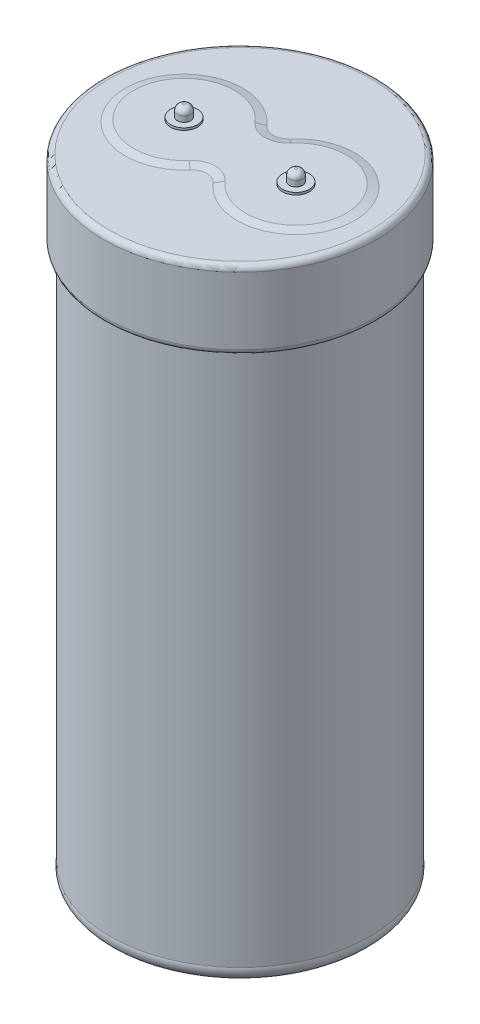
ISO-10303-21;
HEADER;
FILE_DESCRIPTION(('STEP AP214'),'2;1');
FILE_NAME('part.step','',(''),(''),'','','');
FILE_SCHEMA(('AUTOMOTIVE_DESIGN { 1 0 10303 214 1 1 1 1 }'));
ENDSEC;
DATA;
#1=APPLICATION_CONTEXT('core data for automotive mechanical design processes');
#2=APPLICATION_PROTOCOL_DEFINITION('international standard','automotive_design',2000,#1);
#3=PRODUCT_CONTEXT('',#1,'mechanical');
#4=PRODUCT('Part','Part','',(#3));
#5=PRODUCT_RELATED_PRODUCT_CATEGORY('part','',(#4));
#6=PRODUCT_DEFINITION_FORMATION('','',#4);
#7=PRODUCT_DEFINITION_CONTEXT('part definition',#1,'design');
#8=PRODUCT_DEFINITION('design','',#6,#7);
#9=PRODUCT_DEFINITION_SHAPE('','',#8);
#10=(LENGTH_UNIT() NAMED_UNIT(*) SI_UNIT(.MILLI.,.METRE.));
#11=(NAMED_UNIT(*) PLANE_ANGLE_UNIT() SI_UNIT($,.RADIAN.));
#12=(NAMED_UNIT(*) SI_UNIT($,.STERADIAN.) SOLID_ANGLE_UNIT());
#13=UNCERTAINTY_MEASURE_WITH_UNIT(LENGTH_MEASURE(1.E-05),#10,'distance_accuracy_value','');
#14=(GEOMETRIC_REPRESENTATION_CONTEXT(3) GLOBAL_UNCERTAINTY_ASSIGNED_CONTEXT((#13)) GLOBAL_UNIT_ASSIGNED_CONTEXT((#10,
#11,#12)) REPRESENTATION_CONTEXT('',''));
#15=CARTESIAN_POINT('',(0.,0.,0.));
#16=DIRECTION('',(0.,0.,1.));
#17=DIRECTION('',(1.,0.,0.));
#18=AXIS2_PLACEMENT_3D('',#15,#16,#17);
#19=CARTESIAN_POINT('',(0.,125.424101690233,0.));
#20=DIRECTION('',(0.,-1.,0.));
#21=DIRECTION('',(0.,0.,-1.));
#22=AXIS2_PLACEMENT_3D('',#19,#20,#21);
#23=PLANE('',#22);
#24=CARTESIAN_POINT('',(0.,125.424101690233,0.));
#25=DIRECTION('',(0.,-1.,0.));
#26=DIRECTION('',(0.,0.,-1.));
#27=AXIS2_PLACEMENT_3D('',#24,#25,#26);
#28=CIRCLE('',#27,58.5);
#29=CARTESIAN_POINT('',(0.,125.424101690233,-58.5));
#30=VERTEX_POINT('',#29);
#31=EDGE_CURVE('E175',#30,#30,#28,.F.);
#32=ORIENTED_EDGE('',*,*,#31,.T.);
#33=EDGE_LOOP('',(#32));
#34=FACE_BOUND('',#33,.T.);
#35=CARTESIAN_POINT('',(25.,125.424101690233,0.));
#36=DIRECTION('',(0.,1.,0.));
#37=DIRECTION('',(-1.,0.,0.));
#38=AXIS2_PLACEMENT_3D('',#35,#36,#37);
#39=CIRCLE('',#38,26.25);
#40=CARTESIAN_POINT('',(5.11363636363637,125.424101690233,17.134615295428));
#41=VERTEX_POINT('',#40);
#42=CARTESIAN_POINT('',(5.11363636363637,125.424101690233,-17.134615295428));
#43=VERTEX_POINT('',#42);
#44=EDGE_CURVE('E111',#41,#43,#39,.T.);
#45=ORIENTED_EDGE('',*,*,#44,.F.);
#46=CARTESIAN_POINT('',(0.,125.424101690233,21.540659228538));
#47=DIRECTION('',(0.,-1.,0.));
#48=DIRECTION('',(-1.,0.,0.));
#49=AXIS2_PLACEMENT_3D('',#46,#47,#48);
#50=CIRCLE('',#49,6.75);
#51=CARTESIAN_POINT('',(-5.11363636363636,125.424101690233,17.134615295428));
#52=VERTEX_POINT('',#51);
#53=EDGE_CURVE('E96',#52,#41,#50,.T.);
#54=ORIENTED_EDGE('',*,*,#53,.F.);
#55=CARTESIAN_POINT('',(-25.,125.424101690233,0.));
#56=DIRECTION('',(0.,1.,0.));
#57=DIRECTION('',(1.,0.,0.));
#58=AXIS2_PLACEMENT_3D('',#55,#56,#57);
#59=CIRCLE('',#58,26.25);
#60=CARTESIAN_POINT('',(-5.11363636363636,125.424101690233,-17.134615295428));
#61=VERTEX_POINT('',#60);
#62=EDGE_CURVE('E90',#61,#52,#59,.T.);
#63=ORIENTED_EDGE('',*,*,#62,.F.);
#64=CARTESIAN_POINT('',(0.,125.424101690233,-21.540659228538));
#65=DIRECTION('',(0.,-1.,0.));
#66=DIRECTION('',(1.,0.,0.));
#67=AXIS2_PLACEMENT_3D('',#64,#65,#66);
#68=CIRCLE('',#67,6.75);
#69=EDGE_CURVE('E94',#43,#61,#68,.T.);
#70=ORIENTED_EDGE('',*,*,#69,.F.);
#71=EDGE_LOOP('',(#45,#54,#63,#70));
#72=FACE_BOUND('',#71,.T.);
#73=ADVANCED_FACE('F44',(#34,#72),#23,.F.);
#74=CARTESIAN_POINT('',(0.,125.424101690233,0.));
#75=DIRECTION('',(0.,1.,0.));
#76=DIRECTION('',(0.,0.,1.));
#77=AXIS2_PLACEMENT_3D('',#74,#75,#76);
#78=CYLINDRICAL_SURFACE('',#77,61.);
#79=CARTESIAN_POINT('',(0.,92.9241016902328,0.));
#80=DIRECTION('',(0.,1.,0.));
#81=DIRECTION('',(0.,0.,1.));
#82=AXIS2_PLACEMENT_3D('',#79,#80,#81);
#83=CIRCLE('',#82,61.);
#84=CARTESIAN_POINT('',(0.,92.9241016902328,61.));
#85=VERTEX_POINT('',#84);
#86=EDGE_CURVE('E167',#85,#85,#83,.T.);
#87=ORIENTED_EDGE('',*,*,#86,.T.);
#88=EDGE_LOOP('',(#87));
#89=FACE_BOUND('',#88,.T.);
#90=CARTESIAN_POINT('',(0.,122.924101690233,0.));
#91=DIRECTION('',(0.,-1.,0.));
#92=DIRECTION('',(0.,0.,-1.));
#93=AXIS2_PLACEMENT_3D('',#90,#91,#92);
#94=CIRCLE('',#93,61.);
#95=CARTESIAN_POINT('',(0.,122.924101690233,-61.));
#96=VERTEX_POINT('',#95);
#97=EDGE_CURVE('E163',#96,#96,#94,.T.);
#98=ORIENTED_EDGE('',*,*,#97,.T.);
#99=EDGE_LOOP('',(#98));
#100=FACE_BOUND('',#99,.T.);
#101=ADVANCED_FACE('F239',(#89,#100),#78,.T.);
#102=CARTESIAN_POINT('',(61.,90.4241016902328,0.));
#103=DIRECTION('',(0.,1.,0.));
#104=DIRECTION('',(0.,0.,1.));
#105=AXIS2_PLACEMENT_3D('',#102,#103,#104);
#106=PLANE('',#105);
#107=CARTESIAN_POINT('',(0.,90.4241016902328,0.));
#108=DIRECTION('',(0.,1.,0.));
#109=DIRECTION('',(0.,0.,1.));
#110=AXIS2_PLACEMENT_3D('',#107,#108,#109);
#111=CIRCLE('',#110,58.5);
#112=CARTESIAN_POINT('',(0.,90.4241016902328,58.5));
#113=VERTEX_POINT('',#112);
#114=EDGE_CURVE('E171',#113,#113,#111,.F.);
#115=ORIENTED_EDGE('',*,*,#114,.T.);
#116=EDGE_LOOP('',(#115));
#117=FACE_BOUND('',#116,.T.);
#118=CARTESIAN_POINT('',(0.,90.4241016902328,0.));
#119=DIRECTION('',(0.,1.,0.));
#120=DIRECTION('',(0.,0.,1.));
#121=AXIS2_PLACEMENT_3D('',#118,#119,#120);
#122=CIRCLE('',#121,58.);
#123=CARTESIAN_POINT('',(0.,90.4241016902328,58.));
#124=VERTEX_POINT('',#123);
#125=EDGE_CURVE('E141',#124,#124,#122,.T.);
#126=ORIENTED_EDGE('',*,*,#125,.T.);
#127=EDGE_LOOP('',(#126));
#128=FACE_BOUND('',#127,.T.);
#129=ADVANCED_FACE('F245',(#117,#128),#106,.F.);
#130=CARTESIAN_POINT('',(0.,125.424101690233,0.));
#131=DIRECTION('',(0.,1.,0.));
#132=DIRECTION('',(0.,0.,1.));
#133=AXIS2_PLACEMENT_3D('',#130,#131,#132);
#134=CYLINDRICAL_SURFACE('',#133,58.);
#135=ORIENTED_EDGE('',*,*,#125,.F.);
#136=EDGE_LOOP('',(#135));
#137=FACE_BOUND('',#136,.T.);
#138=CARTESIAN_POINT('',(0.,-148.244074885505,0.));
#139=DIRECTION('',(0.,1.,0.));
#140=DIRECTION('',(0.,0.,1.));
#141=AXIS2_PLACEMENT_3D('',#138,#139,#140);
#142=CIRCLE('',#141,58.);
#143=CARTESIAN_POINT('',(0.,-148.244074885505,58.));
#144=VERTEX_POINT('',#143);
#145=EDGE_CURVE('E137',#144,#144,#142,.T.);
#146=ORIENTED_EDGE('',*,*,#145,.T.);
#147=EDGE_LOOP('',(#146));
#148=FACE_BOUND('',#147,.T.);
#149=ADVANCED_FACE('F389',(#137,#148),#134,.T.);
#150=CARTESIAN_POINT('',(0.,-149.503472890604,0.));
#151=DIRECTION('',(0.,1.,0.));
#152=DIRECTION('',(0.,0.,1.));
#153=AXIS2_PLACEMENT_3D('',#150,#151,#152);
#154=TOROIDAL_SURFACE('',#153,53.086404951797,5.07242541916328);
#155=ORIENTED_EDGE('',*,*,#145,.F.);
#156=EDGE_LOOP('',(#155));
#157=FACE_BOUND('',#156,.T.);
#158=CARTESIAN_POINT('',(0.,-154.575898309767,0.));
#159=DIRECTION('',(0.,1.,0.));
#160=DIRECTION('',(0.,0.,1.));
#161=AXIS2_PLACEMENT_3D('',#158,#159,#160);
#162=CIRCLE('',#161,53.086404951797);
#163=CARTESIAN_POINT('',(0.,-154.575898309767,53.086404951797));
#164=VERTEX_POINT('',#163);
#165=EDGE_CURVE('E133',#164,#164,#162,.T.);
#166=ORIENTED_EDGE('',*,*,#165,.T.);
#167=EDGE_LOOP('',(#166));
#168=FACE_BOUND('',#167,.T.);
#169=ADVANCED_FACE('F380',(#157,#168),#154,.T.);
#170=CARTESIAN_POINT('',(53.086404951797,-154.575898309767,0.));
#171=DIRECTION('',(0.,1.,0.));
#172=DIRECTION('',(0.,0.,1.));
#173=AXIS2_PLACEMENT_3D('',#170,#171,#172);
#174=PLANE('',#173);
#175=ORIENTED_EDGE('',*,*,#165,.F.);
#176=EDGE_LOOP('',(#175));
#177=FACE_BOUND('',#176,.T.);
#178=CARTESIAN_POINT('',(0.,-154.575898309767,0.));
#179=DIRECTION('',(0.,1.,0.));
#180=DIRECTION('',(0.,0.,1.));
#181=AXIS2_PLACEMENT_3D('',#178,#179,#180);
#182=CIRCLE('',#181,6.00000000000003);
#183=CARTESIAN_POINT('',(0.,-154.575898309767,6.00000000000003));
#184=VERTEX_POINT('',#183);
#185=EDGE_CURVE('E129',#184,#184,#182,.T.);
#186=ORIENTED_EDGE('',*,*,#185,.T.);
#187=EDGE_LOOP('',(#186));
#188=FACE_BOUND('',#187,.T.);
#189=ADVANCED_FACE('F371',(#177,#188),#174,.F.);
#190=CARTESIAN_POINT('',(0.,125.424101690233,0.));
#191=DIRECTION('',(0.,1.,0.));
#192=DIRECTION('',(0.,0.,1.));
#193=AXIS2_PLACEMENT_3D('',#190,#191,#192);
#194=CYLINDRICAL_SURFACE('',#193,6.00000000000003);
#195=ORIENTED_EDGE('',*,*,#185,.F.);
#196=EDGE_LOOP('',(#195));
#197=FACE_BOUND('',#196,.T.);
#198=CARTESIAN_POINT('',(0.,-169.763264472993,0.));
#199=DIRECTION('',(0.,1.,0.));
#200=DIRECTION('',(0.,0.,1.));
#201=AXIS2_PLACEMENT_3D('',#198,#199,#200);
#202=CIRCLE('',#201,6.00000000000003);
#203=CARTESIAN_POINT('',(0.,-169.763264472993,6.00000000000003));
#204=VERTEX_POINT('',#203);
#205=EDGE_CURVE('E125',#204,#204,#202,.T.);
#206=ORIENTED_EDGE('',*,*,#205,.T.);
#207=EDGE_LOOP('',(#206));
#208=FACE_BOUND('',#207,.T.);
#209=ADVANCED_FACE('F362',(#197,#208),#194,.T.);
#210=CARTESIAN_POINT('',(0.,-170.575898309767,0.));
#211=DIRECTION('',(0.,1.,0.));
#212=DIRECTION('',(0.,0.,1.));
#213=AXIS2_PLACEMENT_3D('',#210,#211,#212);
#214=CONICAL_SURFACE('',#213,5.18736616322535,0.785398163397469);
#215=ORIENTED_EDGE('',*,*,#205,.F.);
#216=EDGE_LOOP('',(#215));
#217=FACE_BOUND('',#216,.T.);
#218=CARTESIAN_POINT('',(0.,-170.575898309767,0.));
#219=DIRECTION('',(0.,1.,0.));
#220=DIRECTION('',(0.,0.,1.));
#221=AXIS2_PLACEMENT_3D('',#218,#219,#220);
#222=CIRCLE('',#221,5.18736616322535);
#223=CARTESIAN_POINT('',(0.,-170.575898309767,5.18736616322535));
#224=VERTEX_POINT('',#223);
#225=EDGE_CURVE('E121',#224,#224,#222,.T.);
#226=ORIENTED_EDGE('',*,*,#225,.T.);
#227=EDGE_LOOP('',(#226));
#228=FACE_BOUND('',#227,.T.);
#229=ADVANCED_FACE('F353',(#217,#228),#214,.T.);
#230=CARTESIAN_POINT('',(5.18736616322535,-170.575898309767,0.));
#231=DIRECTION('',(0.,1.,0.));
#232=DIRECTION('',(0.,0.,1.));
#233=AXIS2_PLACEMENT_3D('',#230,#231,#232);
#234=PLANE('',#233);
#235=ORIENTED_EDGE('',*,*,#225,.F.);
#236=EDGE_LOOP('',(#235));
#237=FACE_BOUND('',#236,.T.);
#238=ADVANCED_FACE('F218',(#237),#234,.F.);
#239=CARTESIAN_POINT('',(12.5,126.424101690233,-10.770329614269));
#240=DIRECTION('',(0.,1.,0.));
#241=DIRECTION('',(-1.,0.,0.));
#242=AXIS2_PLACEMENT_3D('',#239,#240,#241);
#243=PLANE('',#242);
#244=CARTESIAN_POINT('',(0.,126.424101690233,21.540659228538));
#245=DIRECTION('',(0.,1.,0.));
#246=DIRECTION('',(-1.,0.,0.));
#247=AXIS2_PLACEMENT_3D('',#244,#245,#246);
#248=CIRCLE('',#247,10.4820508075688);
#249=CARTESIAN_POINT('',(-7.9409475814915,126.424101690233,14.6985293963544));
#250=VERTEX_POINT('',#249);
#251=CARTESIAN_POINT('',(7.94094758149151,126.424101690233,14.6985293963544));
#252=VERTEX_POINT('',#251);
#253=EDGE_CURVE('E70',#250,#252,#248,.F.);
#254=ORIENTED_EDGE('',*,*,#253,.T.);
#255=CARTESIAN_POINT('',(25.,126.424101690233,0.));
#256=DIRECTION('',(0.,1.,0.));
#257=DIRECTION('',(-1.,0.,0.));
#258=AXIS2_PLACEMENT_3D('',#255,#256,#257);
#259=CIRCLE('',#258,22.5179491924312);
#260=CARTESIAN_POINT('',(7.94094758149151,126.424101690233,-14.6985293963544));
#261=VERTEX_POINT('',#260);
#262=EDGE_CURVE('E11',#252,#261,#259,.T.);
#263=ORIENTED_EDGE('',*,*,#262,.T.);
#264=CARTESIAN_POINT('',(0.,126.424101690233,-21.540659228538));
#265=DIRECTION('',(0.,1.,0.));
#266=DIRECTION('',(-1.,0.,0.));
#267=AXIS2_PLACEMENT_3D('',#264,#265,#266);
#268=CIRCLE('',#267,10.4820508075688);
#269=CARTESIAN_POINT('',(-7.9409475814915,126.424101690233,-14.6985293963544));
#270=VERTEX_POINT('',#269);
#271=EDGE_CURVE('E55',#261,#270,#268,.F.);
#272=ORIENTED_EDGE('',*,*,#271,.T.);
#273=CARTESIAN_POINT('',(-25.,126.424101690233,0.));
#274=DIRECTION('',(0.,1.,0.));
#275=DIRECTION('',(-1.,0.,0.));
#276=AXIS2_PLACEMENT_3D('',#273,#274,#275);
#277=CIRCLE('',#276,22.5179491924312);
#278=EDGE_CURVE('E105',#270,#250,#277,.T.);
#279=ORIENTED_EDGE('',*,*,#278,.T.);
#280=EDGE_LOOP('',(#254,#263,#272,#279));
#281=FACE_BOUND('',#280,.T.);
#282=CARTESIAN_POINT('',(25.,126.424101690233,0.));
#283=DIRECTION('',(0.,1.,0.));
#284=DIRECTION('',(-1.,0.,0.));
#285=AXIS2_PLACEMENT_3D('',#282,#283,#284);
#286=CIRCLE('',#285,6.);
#287=CARTESIAN_POINT('',(19.,126.424101690233,0.));
#288=VERTEX_POINT('',#287);
#289=EDGE_CURVE('E115',#288,#288,#286,.T.);
#290=ORIENTED_EDGE('',*,*,#289,.F.);
#291=EDGE_LOOP('',(#290));
#292=FACE_BOUND('',#291,.T.);
#293=CARTESIAN_POINT('',(-25.,126.424101690233,0.));
#294=DIRECTION('',(0.,1.,0.));
#295=DIRECTION('',(1.,0.,0.));
#296=AXIS2_PLACEMENT_3D('',#293,#294,#295);
#297=CIRCLE('',#296,6.);
#298=CARTESIAN_POINT('',(-19.,126.424101690233,0.));
#299=VERTEX_POINT('',#298);
#300=EDGE_CURVE('E200',#299,#299,#297,.T.);
#301=ORIENTED_EDGE('',*,*,#300,.F.);
#302=EDGE_LOOP('',(#301));
#303=FACE_BOUND('',#302,.T.);
#304=ADVANCED_FACE('F214',(#281,#292,#303),#243,.T.);
#305=CARTESIAN_POINT('',(-25.,127.424101690233,0.));
#306=DIRECTION('',(0.,-1.,0.));
#307=DIRECTION('',(1.,0.,0.));
#308=AXIS2_PLACEMENT_3D('',#305,#306,#307);
#309=CYLINDRICAL_SURFACE('',#308,6.);
#310=ORIENTED_EDGE('',*,*,#300,.T.);
#311=EDGE_LOOP('',(#310));
#312=FACE_BOUND('',#311,.T.);
#313=CARTESIAN_POINT('',(-25.,127.424101690233,0.));
#314=DIRECTION('',(0.,1.,0.));
#315=DIRECTION('',(-1.,0.,0.));
#316=AXIS2_PLACEMENT_3D('',#313,#314,#315);
#317=CIRCLE('',#316,6.);
#318=CARTESIAN_POINT('',(-31.,127.424101690233,0.));
#319=VERTEX_POINT('',#318);
#320=EDGE_CURVE('E194',#319,#319,#317,.T.);
#321=ORIENTED_EDGE('',*,*,#320,.F.);
#322=EDGE_LOOP('',(#321));
#323=FACE_BOUND('',#322,.T.);
#324=ADVANCED_FACE('F217',(#312,#323),#309,.T.);
#325=CARTESIAN_POINT('',(-25.,127.424101690233,0.));
#326=DIRECTION('',(0.,1.,0.));
#327=DIRECTION('',(-1.,0.,0.));
#328=AXIS2_PLACEMENT_3D('',#325,#326,#327);
#329=PLANE('',#328);
#330=CARTESIAN_POINT('',(-25.,127.424101690233,0.));
#331=DIRECTION('',(0.,1.,0.));
#332=DIRECTION('',(-1.,0.,0.));
#333=AXIS2_PLACEMENT_3D('',#330,#331,#332);
#334=CIRCLE('',#333,2.99999999999999);
#335=CARTESIAN_POINT('',(-28.,127.424101690233,0.));
#336=VERTEX_POINT('',#335);
#337=EDGE_CURVE('E151',#336,#336,#334,.T.);
#338=ORIENTED_EDGE('',*,*,#337,.F.);
#339=EDGE_LOOP('',(#338));
#340=FACE_BOUND('',#339,.T.);
#341=ORIENTED_EDGE('',*,*,#320,.T.);
#342=EDGE_LOOP('',(#341));
#343=FACE_BOUND('',#342,.T.);
#344=ADVANCED_FACE('F224',(#340,#343),#329,.T.);
#345=CARTESIAN_POINT('',(25.,127.424101690233,0.));
#346=DIRECTION('',(0.,-1.,0.));
#347=DIRECTION('',(1.,0.,0.));
#348=AXIS2_PLACEMENT_3D('',#345,#346,#347);
#349=CYLINDRICAL_SURFACE('',#348,6.);
#350=ORIENTED_EDGE('',*,*,#289,.T.);
#351=EDGE_LOOP('',(#350));
#352=FACE_BOUND('',#351,.T.);
#353=CARTESIAN_POINT('',(25.,127.424101690233,0.));
#354=DIRECTION('',(0.,1.,0.));
#355=DIRECTION('',(-1.,0.,0.));
#356=AXIS2_PLACEMENT_3D('',#353,#354,#355);
#357=CIRCLE('',#356,6.);
#358=CARTESIAN_POINT('',(19.,127.424101690233,0.));
#359=VERTEX_POINT('',#358);
#360=EDGE_CURVE('E192',#359,#359,#357,.T.);
#361=ORIENTED_EDGE('',*,*,#360,.F.);
#362=EDGE_LOOP('',(#361));
#363=FACE_BOUND('',#362,.T.);
#364=ADVANCED_FACE('F211',(#352,#363),#349,.T.);
#365=CARTESIAN_POINT('',(25.,127.424101690233,0.));
#366=DIRECTION('',(0.,1.,0.));
#367=DIRECTION('',(-1.,0.,0.));
#368=AXIS2_PLACEMENT_3D('',#365,#366,#367);
#369=PLANE('',#368);
#370=CARTESIAN_POINT('',(25.,127.424101690233,0.));
#371=DIRECTION('',(0.,1.,0.));
#372=DIRECTION('',(1.,0.,0.));
#373=AXIS2_PLACEMENT_3D('',#370,#371,#372);
#374=CIRCLE('',#373,3.);
#375=CARTESIAN_POINT('',(28.,127.424101690233,0.));
#376=VERTEX_POINT('',#375);
#377=EDGE_CURVE('E145',#376,#376,#374,.T.);
#378=ORIENTED_EDGE('',*,*,#377,.F.);
#379=EDGE_LOOP('',(#378));
#380=FACE_BOUND('',#379,.T.);
#381=ORIENTED_EDGE('',*,*,#360,.T.);
#382=EDGE_LOOP('',(#381));
#383=FACE_BOUND('',#382,.T.);
#384=ADVANCED_FACE('F234',(#380,#383),#369,.T.);
#385=CARTESIAN_POINT('',(25.,132.424101690233,0.));
#386=DIRECTION('',(0.,-1.,0.));
#387=DIRECTION('',(1.,0.,0.));
#388=AXIS2_PLACEMENT_3D('',#385,#386,#387);
#389=CYLINDRICAL_SURFACE('',#388,3.);
#390=CARTESIAN_POINT('',(25.,129.924101690233,0.));
#391=DIRECTION('',(0.,-1.,0.));
#392=DIRECTION('',(1.,0.,0.));
#393=AXIS2_PLACEMENT_3D('',#390,#391,#392);
#394=CIRCLE('',#393,3.);
#395=CARTESIAN_POINT('',(28.,129.924101690233,0.));
#396=VERTEX_POINT('',#395);
#397=EDGE_CURVE('E150',#396,#396,#394,.T.);
#398=ORIENTED_EDGE('',*,*,#397,.T.);
#399=EDGE_LOOP('',(#398));
#400=FACE_BOUND('',#399,.T.);
#401=ORIENTED_EDGE('',*,*,#377,.T.);
#402=EDGE_LOOP('',(#401));
#403=FACE_BOUND('',#402,.T.);
#404=ADVANCED_FACE('F316',(#400,#403),#389,.T.);
#405=CARTESIAN_POINT('',(25.,132.424101690233,0.));
#406=DIRECTION('',(0.,-1.,0.));
#407=DIRECTION('',(1.,0.,0.));
#408=AXIS2_PLACEMENT_3D('',#405,#406,#407);
#409=PLANE('',#408);
#410=CARTESIAN_POINT('',(25.,132.424101690233,0.));
#411=DIRECTION('',(0.,-1.,0.));
#412=DIRECTION('',(1.,0.,0.));
#413=AXIS2_PLACEMENT_3D('',#410,#411,#412);
#414=CIRCLE('',#413,0.500000000000001);
#415=CARTESIAN_POINT('',(25.5,132.424101690233,0.));
#416=VERTEX_POINT('',#415);
#417=EDGE_CURVE('E146',#416,#416,#414,.F.);
#418=ORIENTED_EDGE('',*,*,#417,.T.);
#419=EDGE_LOOP('',(#418));
#420=FACE_BOUND('',#419,.T.);
#421=ADVANCED_FACE('F309',(#420),#409,.F.);
#422=CARTESIAN_POINT('',(-25.,132.424101690233,0.));
#423=DIRECTION('',(0.,-1.,0.));
#424=DIRECTION('',(1.,0.,0.));
#425=AXIS2_PLACEMENT_3D('',#422,#423,#424);
#426=CYLINDRICAL_SURFACE('',#425,2.99999999999999);
#427=CARTESIAN_POINT('',(-25.,129.924101690233,0.));
#428=DIRECTION('',(0.,1.,0.));
#429=DIRECTION('',(-1.,0.,0.));
#430=AXIS2_PLACEMENT_3D('',#427,#428,#429);
#431=CIRCLE('',#430,2.99999999999999);
#432=CARTESIAN_POINT('',(-28.,129.924101690233,0.));
#433=VERTEX_POINT('',#432);
#434=EDGE_CURVE('E159',#433,#433,#431,.F.);
#435=ORIENTED_EDGE('',*,*,#434,.T.);
#436=EDGE_LOOP('',(#435));
#437=FACE_BOUND('',#436,.T.);
#438=ORIENTED_EDGE('',*,*,#337,.T.);
#439=EDGE_LOOP('',(#438));
#440=FACE_BOUND('',#439,.T.);
#441=ADVANCED_FACE('F302',(#437,#440),#426,.T.);
#442=CARTESIAN_POINT('',(-25.,132.424101690233,0.));
#443=DIRECTION('',(0.,1.,0.));
#444=DIRECTION('',(-1.,0.,0.));
#445=AXIS2_PLACEMENT_3D('',#442,#443,#444);
#446=PLANE('',#445);
#447=CARTESIAN_POINT('',(-25.,132.424101690233,0.));
#448=DIRECTION('',(0.,1.,0.));
#449=DIRECTION('',(-1.,0.,0.));
#450=AXIS2_PLACEMENT_3D('',#447,#448,#449);
#451=CIRCLE('',#450,0.499999999999987);
#452=CARTESIAN_POINT('',(-25.5,132.424101690233,0.));
#453=VERTEX_POINT('',#452);
#454=EDGE_CURVE('E155',#453,#453,#451,.T.);
#455=ORIENTED_EDGE('',*,*,#454,.T.);
#456=EDGE_LOOP('',(#455));
#457=FACE_BOUND('',#456,.T.);
#458=ADVANCED_FACE('F254',(#457),#446,.T.);
#459=CARTESIAN_POINT('',(25.,129.924101690233,0.));
#460=DIRECTION('',(0.,-1.,0.));
#461=DIRECTION('',(1.,0.,0.));
#462=AXIS2_PLACEMENT_3D('',#459,#460,#461);
#463=DEGENERATE_TOROIDAL_SURFACE('',#462,0.500000000000001,2.5,.T.);
#464=ORIENTED_EDGE('',*,*,#397,.F.);
#465=EDGE_LOOP('',(#464));
#466=FACE_BOUND('',#465,.T.);
#467=ORIENTED_EDGE('',*,*,#417,.F.);
#468=EDGE_LOOP('',(#467));
#469=FACE_BOUND('',#468,.T.);
#470=ADVANCED_FACE('F250',(#466,#469),#463,.T.);
#471=CARTESIAN_POINT('',(-25.,129.924101690233,0.));
#472=DIRECTION('',(0.,1.,0.));
#473=DIRECTION('',(-1.,0.,0.));
#474=AXIS2_PLACEMENT_3D('',#471,#472,#473);
#475=DEGENERATE_TOROIDAL_SURFACE('',#474,0.499999999999987,2.5,.T.);
#476=ORIENTED_EDGE('',*,*,#434,.F.);
#477=EDGE_LOOP('',(#476));
#478=FACE_BOUND('',#477,.T.);
#479=ORIENTED_EDGE('',*,*,#454,.F.);
#480=EDGE_LOOP('',(#479));
#481=FACE_BOUND('',#480,.T.);
#482=ADVANCED_FACE('F253',(#478,#481),#475,.T.);
#483=CARTESIAN_POINT('',(0.,92.9241016902328,0.));
#484=DIRECTION('',(0.,1.,0.));
#485=DIRECTION('',(0.,0.,1.));
#486=AXIS2_PLACEMENT_3D('',#483,#484,#485);
#487=TOROIDAL_SURFACE('',#486,58.5,2.5);
#488=ORIENTED_EDGE('',*,*,#114,.F.);
#489=EDGE_LOOP('',(#488));
#490=FACE_BOUND('',#489,.T.);
#491=ORIENTED_EDGE('',*,*,#86,.F.);
#492=EDGE_LOOP('',(#491));
#493=FACE_BOUND('',#492,.T.);
#494=ADVANCED_FACE('F258',(#490,#493),#487,.T.);
#495=CARTESIAN_POINT('',(0.,122.924101690233,0.));
#496=DIRECTION('',(0.,-1.,0.));
#497=DIRECTION('',(0.,0.,-1.));
#498=AXIS2_PLACEMENT_3D('',#495,#496,#497);
#499=TOROIDAL_SURFACE('',#498,58.5,2.5);
#500=ORIENTED_EDGE('',*,*,#97,.F.);
#501=EDGE_LOOP('',(#500));
#502=FACE_BOUND('',#501,.T.);
#503=ORIENTED_EDGE('',*,*,#31,.F.);
#504=EDGE_LOOP('',(#503));
#505=FACE_BOUND('',#504,.T.);
#506=ADVANCED_FACE('F262',(#502,#505),#499,.T.);
#507=CARTESIAN_POINT('',(-25.,126.424101690233,0.));
#508=DIRECTION('',(0.,-1.,0.));
#509=DIRECTION('',(0.,0.,-1.));
#510=AXIS2_PLACEMENT_3D('',#507,#508,#509);
#511=CONICAL_SURFACE('',#510,22.5179491924312,1.30899693899574);
#512=DIRECTION('',(-0.731761989612929,0.258819045102527,0.630505426185964));
#513=VECTOR('',#512,1.);
#514=CARTESIAN_POINT('',(-5.11363636363636,125.424101690233,-17.134615295428));
#515=LINE('',#514,#513);
#516=EDGE_CURVE('E104',#61,#270,#515,.T.);
#517=ORIENTED_EDGE('',*,*,#516,.F.);
#518=ORIENTED_EDGE('',*,*,#62,.T.);
#519=DIRECTION('',(0.731761989612929,-0.258819045102527,0.630505426185964));
#520=VECTOR('',#519,1.);
#521=CARTESIAN_POINT('',(-7.9409475814915,126.424101690233,14.6985293963544));
#522=LINE('',#521,#520);
#523=EDGE_CURVE('E49',#250,#52,#522,.T.);
#524=ORIENTED_EDGE('',*,*,#523,.F.);
#525=ORIENTED_EDGE('',*,*,#278,.F.);
#526=EDGE_LOOP('',(#517,#518,#524,#525));
#527=FACE_BOUND('',#526,.T.);
#528=ADVANCED_FACE('F47',(#527),#511,.T.);
#529=CARTESIAN_POINT('',(0.,126.424101690233,21.540659228538));
#530=DIRECTION('',(0.,1.,0.));
#531=DIRECTION('',(-1.,0.,0.));
#532=AXIS2_PLACEMENT_3D('',#529,#530,#531);
#533=CONICAL_SURFACE('',#532,10.4820508075688,1.30899693899574);
#534=ORIENTED_EDGE('',*,*,#523,.T.);
#535=ORIENTED_EDGE('',*,*,#53,.T.);
#536=DIRECTION('',(-0.731761989612929,-0.258819045102527,0.630505426185963));
#537=VECTOR('',#536,1.);
#538=CARTESIAN_POINT('',(7.94094758149151,126.424101690233,14.6985293963544));
#539=LINE('',#538,#537);
#540=EDGE_CURVE('E108',#252,#41,#539,.T.);
#541=ORIENTED_EDGE('',*,*,#540,.F.);
#542=ORIENTED_EDGE('',*,*,#253,.F.);
#543=EDGE_LOOP('',(#534,#535,#541,#542));
#544=FACE_BOUND('',#543,.T.);
#545=ADVANCED_FACE('F190',(#544),#533,.F.);
#546=CARTESIAN_POINT('',(0.,126.424101690233,-21.540659228538));
#547=DIRECTION('',(0.,1.,0.));
#548=DIRECTION('',(-1.,0.,0.));
#549=AXIS2_PLACEMENT_3D('',#546,#547,#548);
#550=CONICAL_SURFACE('',#549,10.4820508075688,1.30899693899574);
#551=ORIENTED_EDGE('',*,*,#516,.T.);
#552=ORIENTED_EDGE('',*,*,#271,.F.);
#553=DIRECTION('',(0.731761989612929,0.258819045102527,0.630505426185964));
#554=VECTOR('',#553,1.);
#555=CARTESIAN_POINT('',(5.11363636363637,125.424101690233,-17.134615295428));
#556=LINE('',#555,#554);
#557=EDGE_CURVE('E63',#43,#261,#556,.T.);
#558=ORIENTED_EDGE('',*,*,#557,.F.);
#559=ORIENTED_EDGE('',*,*,#69,.T.);
#560=EDGE_LOOP('',(#551,#552,#558,#559));
#561=FACE_BOUND('',#560,.T.);
#562=ADVANCED_FACE('F109',(#561),#550,.F.);
#563=CARTESIAN_POINT('',(25.,126.424101690233,0.));
#564=DIRECTION('',(0.,-1.,0.));
#565=DIRECTION('',(0.,0.,-1.));
#566=AXIS2_PLACEMENT_3D('',#563,#564,#565);
#567=CONICAL_SURFACE('',#566,22.5179491924312,1.30899693899574);
#568=ORIENTED_EDGE('',*,*,#540,.T.);
#569=ORIENTED_EDGE('',*,*,#44,.T.);
#570=ORIENTED_EDGE('',*,*,#557,.T.);
#571=ORIENTED_EDGE('',*,*,#262,.F.);
#572=EDGE_LOOP('',(#568,#569,#570,#571));
#573=FACE_BOUND('',#572,.T.);
#574=ADVANCED_FACE('F188',(#573),#567,.T.);
#575=CLOSED_SHELL('',(#73,#101,#129,#149,#169,#189,#209,#229,#238,#304,#324,#344,#364,#384,#404,
#421,#441,#458,#470,#482,#494,#506,#528,#545,#562,#574));
#576=MANIFOLD_SOLID_BREP('B2',#575);
#577=ADVANCED_BREP_SHAPE_REPRESENTATION('',(#18,#576),#14);
#578=SHAPE_DEFINITION_REPRESENTATION(#9,#577);
ENDSEC;
END-ISO-10303-21;
